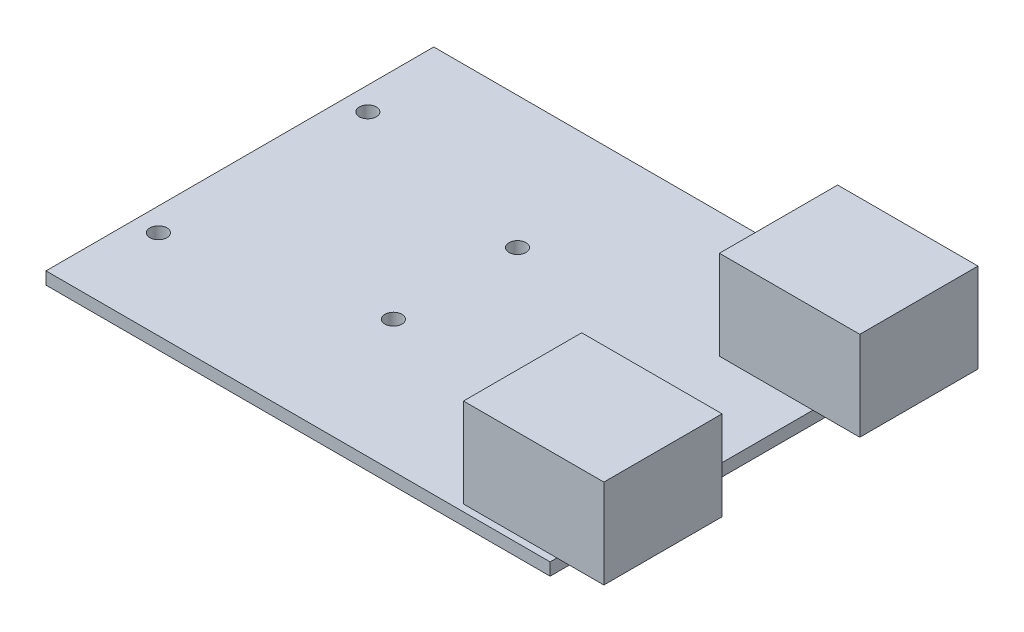
ISO-10303-21;
HEADER;
FILE_DESCRIPTION(('STEP AP214'),'2;1');
FILE_NAME('part.step','',(''),(''),'','','');
FILE_SCHEMA(('AUTOMOTIVE_DESIGN { 1 0 10303 214 1 1 1 1 }'));
ENDSEC;
DATA;
#1=APPLICATION_CONTEXT('core data for automotive mechanical design processes');
#2=APPLICATION_PROTOCOL_DEFINITION('international standard','automotive_design',2000,#1);
#3=PRODUCT_CONTEXT('',#1,'mechanical');
#4=PRODUCT('Part','Part','',(#3));
#5=PRODUCT_RELATED_PRODUCT_CATEGORY('part','',(#4));
#6=PRODUCT_DEFINITION_FORMATION('','',#4);
#7=PRODUCT_DEFINITION_CONTEXT('part definition',#1,'design');
#8=PRODUCT_DEFINITION('design','',#6,#7);
#9=PRODUCT_DEFINITION_SHAPE('','',#8);
#10=(LENGTH_UNIT() NAMED_UNIT(*) SI_UNIT(.MILLI.,.METRE.));
#11=(NAMED_UNIT(*) PLANE_ANGLE_UNIT() SI_UNIT($,.RADIAN.));
#12=(NAMED_UNIT(*) SI_UNIT($,.STERADIAN.) SOLID_ANGLE_UNIT());
#13=UNCERTAINTY_MEASURE_WITH_UNIT(LENGTH_MEASURE(1.E-05),#10,'distance_accuracy_value','');
#14=(GEOMETRIC_REPRESENTATION_CONTEXT(3) GLOBAL_UNCERTAINTY_ASSIGNED_CONTEXT((#13)) GLOBAL_UNIT_ASSIGNED_CONTEXT((#10,
#11,#12)) REPRESENTATION_CONTEXT('',''));
#15=CARTESIAN_POINT('',(0.,0.,0.));
#16=DIRECTION('',(0.,0.,1.));
#17=DIRECTION('',(1.,0.,0.));
#18=AXIS2_PLACEMENT_3D('',#15,#16,#17);
#19=CARTESIAN_POINT('',(0.,1.6002,0.));
#20=DIRECTION('',(0.,-1.,0.));
#21=DIRECTION('',(0.,0.,-1.));
#22=AXIS2_PLACEMENT_3D('',#19,#20,#21);
#23=PLANE('',#22);
#24=CARTESIAN_POINT('',(3.,1.6002,-11.5));
#25=DIRECTION('',(0.,1.,0.));
#26=DIRECTION('',(0.,0.,1.));
#27=AXIS2_PLACEMENT_3D('',#24,#25,#26);
#28=CIRCLE('',#27,1.09999999999999);
#29=CARTESIAN_POINT('',(3.,1.6002,-10.4));
#30=VERTEX_POINT('',#29);
#31=EDGE_CURVE('E197',#30,#30,#28,.T.);
#32=ORIENTED_EDGE('',*,*,#31,.F.);
#33=EDGE_LOOP('',(#32));
#34=FACE_BOUND('',#33,.T.);
#35=CARTESIAN_POINT('',(3.,1.6002,-38.5));
#36=DIRECTION('',(0.,1.,0.));
#37=DIRECTION('',(0.,0.,1.));
#38=AXIS2_PLACEMENT_3D('',#35,#36,#37);
#39=CIRCLE('',#38,1.09999999999999);
#40=CARTESIAN_POINT('',(3.,1.6002,-37.4));
#41=VERTEX_POINT('',#40);
#42=EDGE_CURVE('E203',#41,#41,#39,.T.);
#43=ORIENTED_EDGE('',*,*,#42,.F.);
#44=EDGE_LOOP('',(#43));
#45=FACE_BOUND('',#44,.T.);
#46=CARTESIAN_POINT('',(27.8,1.6002,-17.));
#47=DIRECTION('',(0.,1.,0.));
#48=DIRECTION('',(0.,0.,1.));
#49=AXIS2_PLACEMENT_3D('',#46,#47,#48);
#50=CIRCLE('',#49,1.09999999999999);
#51=CARTESIAN_POINT('',(27.8,1.6002,-15.9));
#52=VERTEX_POINT('',#51);
#53=EDGE_CURVE('E209',#52,#52,#50,.T.);
#54=ORIENTED_EDGE('',*,*,#53,.F.);
#55=EDGE_LOOP('',(#54));
#56=FACE_BOUND('',#55,.T.);
#57=CARTESIAN_POINT('',(27.8,1.6002,-33.));
#58=DIRECTION('',(0.,1.,0.));
#59=DIRECTION('',(0.,0.,1.));
#60=AXIS2_PLACEMENT_3D('',#57,#58,#59);
#61=CIRCLE('',#60,1.09999999999999);
#62=CARTESIAN_POINT('',(27.8,1.6002,-31.9));
#63=VERTEX_POINT('',#62);
#64=EDGE_CURVE('E215',#63,#63,#61,.T.);
#65=ORIENTED_EDGE('',*,*,#64,.F.);
#66=EDGE_LOOP('',(#65));
#67=FACE_BOUND('',#66,.T.);
#68=DIRECTION('',(-1.,0.,0.));
#69=VECTOR('',#68,1.);
#70=CARTESIAN_POINT('',(52.95,1.6002,-16.12));
#71=LINE('',#70,#69);
#72=CARTESIAN_POINT('',(65.,1.6002,-16.12));
#73=VERTEX_POINT('',#72);
#74=CARTESIAN_POINT('',(52.95,1.6002,-16.12));
#75=VERTEX_POINT('',#74);
#76=EDGE_CURVE('E276',#73,#75,#71,.T.);
#77=ORIENTED_EDGE('',*,*,#76,.F.);
#78=DIRECTION('',(0.,0.,-1.));
#79=VECTOR('',#78,1.);
#80=CARTESIAN_POINT('',(65.,1.6002,0.));
#81=LINE('',#80,#79);
#82=CARTESIAN_POINT('',(65.,1.6002,-33.88));
#83=VERTEX_POINT('',#82);
#84=EDGE_CURVE('E233',#73,#83,#81,.T.);
#85=ORIENTED_EDGE('',*,*,#84,.T.);
#86=DIRECTION('',(1.,0.,0.));
#87=VECTOR('',#86,1.);
#88=CARTESIAN_POINT('',(52.95,1.6002,-33.88));
#89=LINE('',#88,#87);
#90=CARTESIAN_POINT('',(52.95,1.6002,-33.88));
#91=VERTEX_POINT('',#90);
#92=EDGE_CURVE('E172',#91,#83,#89,.T.);
#93=ORIENTED_EDGE('',*,*,#92,.F.);
#94=DIRECTION('',(0.,0.,1.));
#95=VECTOR('',#94,1.);
#96=CARTESIAN_POINT('',(52.95,1.6002,-33.88));
#97=LINE('',#96,#95);
#98=CARTESIAN_POINT('',(52.95,1.6002,-49.12));
#99=VERTEX_POINT('',#98);
#100=EDGE_CURVE('E180',#99,#91,#97,.T.);
#101=ORIENTED_EDGE('',*,*,#100,.F.);
#102=DIRECTION('',(-1.,0.,0.));
#103=VECTOR('',#102,1.);
#104=CARTESIAN_POINT('',(52.95,1.6002,-49.12));
#105=LINE('',#104,#103);
#106=CARTESIAN_POINT('',(65.,1.6002,-49.12));
#107=VERTEX_POINT('',#106);
#108=EDGE_CURVE('E11',#107,#99,#105,.T.);
#109=ORIENTED_EDGE('',*,*,#108,.F.);
#110=CARTESIAN_POINT('',(65.,1.6002,-50.));
#111=VERTEX_POINT('',#110);
#112=EDGE_CURVE('E228',#107,#111,#81,.T.);
#113=ORIENTED_EDGE('',*,*,#112,.T.);
#114=DIRECTION('',(-1.,0.,0.));
#115=VECTOR('',#114,1.);
#116=CARTESIAN_POINT('',(0.,1.6002,-50.));
#117=LINE('',#116,#115);
#118=CARTESIAN_POINT('',(0.,1.6002,-50.));
#119=VERTEX_POINT('',#118);
#120=EDGE_CURVE('E231',#111,#119,#117,.T.);
#121=ORIENTED_EDGE('',*,*,#120,.T.);
#122=DIRECTION('',(0.,0.,1.));
#123=VECTOR('',#122,1.);
#124=CARTESIAN_POINT('',(0.,1.6002,0.));
#125=LINE('',#124,#123);
#126=CARTESIAN_POINT('',(0.,1.6002,0.));
#127=VERTEX_POINT('',#126);
#128=EDGE_CURVE('E222',#119,#127,#125,.T.);
#129=ORIENTED_EDGE('',*,*,#128,.T.);
#130=DIRECTION('',(1.,0.,0.));
#131=VECTOR('',#130,1.);
#132=CARTESIAN_POINT('',(0.,1.6002,0.));
#133=LINE('',#132,#131);
#134=CARTESIAN_POINT('',(65.,1.6002,0.));
#135=VERTEX_POINT('',#134);
#136=EDGE_CURVE('E225',#127,#135,#133,.T.);
#137=ORIENTED_EDGE('',*,*,#136,.T.);
#138=CARTESIAN_POINT('',(65.,1.6002,-0.879999999999995));
#139=VERTEX_POINT('',#138);
#140=EDGE_CURVE('E229',#135,#139,#81,.T.);
#141=ORIENTED_EDGE('',*,*,#140,.T.);
#142=DIRECTION('',(1.,0.,0.));
#143=VECTOR('',#142,1.);
#144=CARTESIAN_POINT('',(52.95,1.6002,-0.879999999999995));
#145=LINE('',#144,#143);
#146=CARTESIAN_POINT('',(52.95,1.6002,-0.879999999999995));
#147=VERTEX_POINT('',#146);
#148=EDGE_CURVE('E54',#147,#139,#145,.T.);
#149=ORIENTED_EDGE('',*,*,#148,.F.);
#150=DIRECTION('',(0.,0.,1.));
#151=VECTOR('',#150,1.);
#152=CARTESIAN_POINT('',(52.95,1.6002,-0.879999999999995));
#153=LINE('',#152,#151);
#154=EDGE_CURVE('E49',#75,#147,#153,.T.);
#155=ORIENTED_EDGE('',*,*,#154,.F.);
#156=EDGE_LOOP('',(#77,#85,#93,#101,#109,#113,#121,#129,#137,#141,#149,#155));
#157=FACE_BOUND('',#156,.T.);
#158=ADVANCED_FACE('F32',(#34,#45,#56,#67,#157),#23,.F.);
#159=CARTESIAN_POINT('',(0.,1.6002,0.));
#160=DIRECTION('',(1.,0.,0.));
#161=DIRECTION('',(0.,0.,-1.));
#162=AXIS2_PLACEMENT_3D('',#159,#160,#161);
#163=PLANE('',#162);
#164=DIRECTION('',(0.,0.,1.));
#165=VECTOR('',#164,1.);
#166=CARTESIAN_POINT('',(0.,0.,0.));
#167=LINE('',#166,#165);
#168=CARTESIAN_POINT('',(0.,0.,-50.));
#169=VERTEX_POINT('',#168);
#170=CARTESIAN_POINT('',(0.,0.,0.));
#171=VERTEX_POINT('',#170);
#172=EDGE_CURVE('E221',#169,#171,#167,.T.);
#173=ORIENTED_EDGE('',*,*,#172,.T.);
#174=DIRECTION('',(0.,-1.,0.));
#175=VECTOR('',#174,1.);
#176=CARTESIAN_POINT('',(0.,1.6002,0.));
#177=LINE('',#176,#175);
#178=EDGE_CURVE('E36',#127,#171,#177,.T.);
#179=ORIENTED_EDGE('',*,*,#178,.F.);
#180=ORIENTED_EDGE('',*,*,#128,.F.);
#181=DIRECTION('',(0.,-1.,0.));
#182=VECTOR('',#181,1.);
#183=CARTESIAN_POINT('',(0.,1.6002,-50.));
#184=LINE('',#183,#182);
#185=EDGE_CURVE('E236',#119,#169,#184,.T.);
#186=ORIENTED_EDGE('',*,*,#185,.T.);
#187=EDGE_LOOP('',(#173,#179,#180,#186));
#188=FACE_BOUND('',#187,.T.);
#189=ADVANCED_FACE('F34',(#188),#163,.F.);
#190=CARTESIAN_POINT('',(0.,1.6002,0.));
#191=DIRECTION('',(0.,0.,-1.));
#192=DIRECTION('',(-1.,0.,0.));
#193=AXIS2_PLACEMENT_3D('',#190,#191,#192);
#194=PLANE('',#193);
#195=DIRECTION('',(1.,0.,0.));
#196=VECTOR('',#195,1.);
#197=CARTESIAN_POINT('',(0.,0.,0.));
#198=LINE('',#197,#196);
#199=CARTESIAN_POINT('',(65.,0.,0.));
#200=VERTEX_POINT('',#199);
#201=EDGE_CURVE('E239',#171,#200,#198,.T.);
#202=ORIENTED_EDGE('',*,*,#201,.T.);
#203=DIRECTION('',(0.,-1.,0.));
#204=VECTOR('',#203,1.);
#205=CARTESIAN_POINT('',(65.,1.6002,0.));
#206=LINE('',#205,#204);
#207=EDGE_CURVE('E248',#135,#200,#206,.T.);
#208=ORIENTED_EDGE('',*,*,#207,.F.);
#209=ORIENTED_EDGE('',*,*,#136,.F.);
#210=ORIENTED_EDGE('',*,*,#178,.T.);
#211=EDGE_LOOP('',(#202,#208,#209,#210));
#212=FACE_BOUND('',#211,.T.);
#213=ADVANCED_FACE('F257',(#212),#194,.F.);
#214=CARTESIAN_POINT('',(65.,1.6002,0.));
#215=DIRECTION('',(-1.,0.,0.));
#216=DIRECTION('',(0.,0.,1.));
#217=AXIS2_PLACEMENT_3D('',#214,#215,#216);
#218=PLANE('',#217);
#219=DIRECTION('',(0.,0.,-1.));
#220=VECTOR('',#219,1.);
#221=CARTESIAN_POINT('',(65.,0.,0.));
#222=LINE('',#221,#220);
#223=CARTESIAN_POINT('',(65.,0.,-50.));
#224=VERTEX_POINT('',#223);
#225=EDGE_CURVE('E241',#200,#224,#222,.T.);
#226=ORIENTED_EDGE('',*,*,#225,.T.);
#227=DIRECTION('',(0.,-1.,0.));
#228=VECTOR('',#227,1.);
#229=CARTESIAN_POINT('',(65.,1.6002,-50.));
#230=LINE('',#229,#228);
#231=EDGE_CURVE('E246',#111,#224,#230,.T.);
#232=ORIENTED_EDGE('',*,*,#231,.F.);
#233=ORIENTED_EDGE('',*,*,#112,.F.);
#234=EDGE_CURVE('E234',#83,#107,#81,.T.);
#235=ORIENTED_EDGE('',*,*,#234,.F.);
#236=ORIENTED_EDGE('',*,*,#84,.F.);
#237=EDGE_CURVE('E232',#139,#73,#81,.T.);
#238=ORIENTED_EDGE('',*,*,#237,.F.);
#239=ORIENTED_EDGE('',*,*,#140,.F.);
#240=ORIENTED_EDGE('',*,*,#207,.T.);
#241=EDGE_LOOP('',(#226,#232,#233,#235,#236,#238,#239,#240));
#242=FACE_BOUND('',#241,.T.);
#243=ADVANCED_FACE('F266',(#242),#218,.F.);
#244=CARTESIAN_POINT('',(0.,1.6002,-50.));
#245=DIRECTION('',(0.,0.,1.));
#246=DIRECTION('',(1.,0.,0.));
#247=AXIS2_PLACEMENT_3D('',#244,#245,#246);
#248=PLANE('',#247);
#249=DIRECTION('',(-1.,0.,0.));
#250=VECTOR('',#249,1.);
#251=CARTESIAN_POINT('',(0.,0.,-50.));
#252=LINE('',#251,#250);
#253=EDGE_CURVE('E226',#224,#169,#252,.T.);
#254=ORIENTED_EDGE('',*,*,#253,.T.);
#255=ORIENTED_EDGE('',*,*,#185,.F.);
#256=ORIENTED_EDGE('',*,*,#120,.F.);
#257=ORIENTED_EDGE('',*,*,#231,.T.);
#258=EDGE_LOOP('',(#254,#255,#256,#257));
#259=FACE_BOUND('',#258,.T.);
#260=ADVANCED_FACE('F270',(#259),#248,.F.);
#261=CARTESIAN_POINT('',(0.,0.,0.));
#262=DIRECTION('',(0.,-1.,0.));
#263=DIRECTION('',(0.,0.,-1.));
#264=AXIS2_PLACEMENT_3D('',#261,#262,#263);
#265=PLANE('',#264);
#266=CARTESIAN_POINT('',(3.,0.,-11.5));
#267=DIRECTION('',(0.,1.,0.));
#268=DIRECTION('',(0.,0.,1.));
#269=AXIS2_PLACEMENT_3D('',#266,#267,#268);
#270=CIRCLE('',#269,1.1);
#271=CARTESIAN_POINT('',(3.,0.,-10.4));
#272=VERTEX_POINT('',#271);
#273=EDGE_CURVE('E200',#272,#272,#270,.T.);
#274=ORIENTED_EDGE('',*,*,#273,.T.);
#275=EDGE_LOOP('',(#274));
#276=FACE_BOUND('',#275,.T.);
#277=CARTESIAN_POINT('',(3.,0.,-38.5));
#278=DIRECTION('',(0.,1.,0.));
#279=DIRECTION('',(0.,0.,1.));
#280=AXIS2_PLACEMENT_3D('',#277,#278,#279);
#281=CIRCLE('',#280,1.1);
#282=CARTESIAN_POINT('',(3.,0.,-37.4));
#283=VERTEX_POINT('',#282);
#284=EDGE_CURVE('E206',#283,#283,#281,.T.);
#285=ORIENTED_EDGE('',*,*,#284,.T.);
#286=EDGE_LOOP('',(#285));
#287=FACE_BOUND('',#286,.T.);
#288=CARTESIAN_POINT('',(27.8,0.,-17.));
#289=DIRECTION('',(0.,1.,0.));
#290=DIRECTION('',(0.,0.,1.));
#291=AXIS2_PLACEMENT_3D('',#288,#289,#290);
#292=CIRCLE('',#291,1.1);
#293=CARTESIAN_POINT('',(27.8,0.,-15.9));
#294=VERTEX_POINT('',#293);
#295=EDGE_CURVE('E212',#294,#294,#292,.T.);
#296=ORIENTED_EDGE('',*,*,#295,.T.);
#297=EDGE_LOOP('',(#296));
#298=FACE_BOUND('',#297,.T.);
#299=CARTESIAN_POINT('',(27.8,0.,-33.));
#300=DIRECTION('',(0.,1.,0.));
#301=DIRECTION('',(0.,0.,1.));
#302=AXIS2_PLACEMENT_3D('',#299,#300,#301);
#303=CIRCLE('',#302,1.1);
#304=CARTESIAN_POINT('',(27.8,0.,-31.9));
#305=VERTEX_POINT('',#304);
#306=EDGE_CURVE('E218',#305,#305,#303,.T.);
#307=ORIENTED_EDGE('',*,*,#306,.T.);
#308=EDGE_LOOP('',(#307));
#309=FACE_BOUND('',#308,.T.);
#310=ORIENTED_EDGE('',*,*,#172,.F.);
#311=ORIENTED_EDGE('',*,*,#253,.F.);
#312=ORIENTED_EDGE('',*,*,#225,.F.);
#313=ORIENTED_EDGE('',*,*,#201,.F.);
#314=EDGE_LOOP('',(#310,#311,#312,#313));
#315=FACE_BOUND('',#314,.T.);
#316=ADVANCED_FACE('F264',(#276,#287,#298,#309,#315),#265,.T.);
#317=CARTESIAN_POINT('',(27.8,1.6002,-33.));
#318=DIRECTION('',(0.,1.,0.));
#319=DIRECTION('',(0.,0.,1.));
#320=AXIS2_PLACEMENT_3D('',#317,#318,#319);
#321=CYLINDRICAL_SURFACE('',#320,1.09999999999999);
#322=ORIENTED_EDGE('',*,*,#306,.F.);
#323=EDGE_LOOP('',(#322));
#324=FACE_BOUND('',#323,.T.);
#325=ORIENTED_EDGE('',*,*,#64,.T.);
#326=EDGE_LOOP('',(#325));
#327=FACE_BOUND('',#326,.T.);
#328=ADVANCED_FACE('F318',(#324,#327),#321,.F.);
#329=CARTESIAN_POINT('',(27.8,1.6002,-17.));
#330=DIRECTION('',(0.,1.,0.));
#331=DIRECTION('',(0.,0.,1.));
#332=AXIS2_PLACEMENT_3D('',#329,#330,#331);
#333=CYLINDRICAL_SURFACE('',#332,1.09999999999999);
#334=ORIENTED_EDGE('',*,*,#295,.F.);
#335=EDGE_LOOP('',(#334));
#336=FACE_BOUND('',#335,.T.);
#337=ORIENTED_EDGE('',*,*,#53,.T.);
#338=EDGE_LOOP('',(#337));
#339=FACE_BOUND('',#338,.T.);
#340=ADVANCED_FACE('F350',(#336,#339),#333,.F.);
#341=CARTESIAN_POINT('',(3.,1.6002,-38.5));
#342=DIRECTION('',(0.,1.,0.));
#343=DIRECTION('',(0.,0.,1.));
#344=AXIS2_PLACEMENT_3D('',#341,#342,#343);
#345=CYLINDRICAL_SURFACE('',#344,1.09999999999999);
#346=ORIENTED_EDGE('',*,*,#284,.F.);
#347=EDGE_LOOP('',(#346));
#348=FACE_BOUND('',#347,.T.);
#349=ORIENTED_EDGE('',*,*,#42,.T.);
#350=EDGE_LOOP('',(#349));
#351=FACE_BOUND('',#350,.T.);
#352=ADVANCED_FACE('F357',(#348,#351),#345,.F.);
#353=CARTESIAN_POINT('',(3.,1.6002,-11.5));
#354=DIRECTION('',(0.,1.,0.));
#355=DIRECTION('',(0.,0.,1.));
#356=AXIS2_PLACEMENT_3D('',#353,#354,#355);
#357=CYLINDRICAL_SURFACE('',#356,1.09999999999999);
#358=ORIENTED_EDGE('',*,*,#273,.F.);
#359=EDGE_LOOP('',(#358));
#360=FACE_BOUND('',#359,.T.);
#361=ORIENTED_EDGE('',*,*,#31,.T.);
#362=EDGE_LOOP('',(#361));
#363=FACE_BOUND('',#362,.T.);
#364=ADVANCED_FACE('F364',(#360,#363),#357,.F.);
#365=CARTESIAN_POINT('',(71.05,13.1002,-33.88));
#366=DIRECTION('',(-1.,0.,0.));
#367=DIRECTION('',(0.,0.,1.));
#368=AXIS2_PLACEMENT_3D('',#365,#366,#367);
#369=PLANE('',#368);
#370=DIRECTION('',(0.,0.,-1.));
#371=VECTOR('',#370,1.);
#372=CARTESIAN_POINT('',(71.05,1.6002,-33.88));
#373=LINE('',#372,#371);
#374=CARTESIAN_POINT('',(71.05,1.6002,-33.88));
#375=VERTEX_POINT('',#374);
#376=CARTESIAN_POINT('',(71.05,1.6002,-49.12));
#377=VERTEX_POINT('',#376);
#378=EDGE_CURVE('E160',#375,#377,#373,.T.);
#379=ORIENTED_EDGE('',*,*,#378,.T.);
#380=DIRECTION('',(0.,-1.,0.));
#381=VECTOR('',#380,1.);
#382=CARTESIAN_POINT('',(71.05,13.1002,-49.12));
#383=LINE('',#382,#381);
#384=CARTESIAN_POINT('',(71.05,13.1002,-49.12));
#385=VERTEX_POINT('',#384);
#386=EDGE_CURVE('E194',#385,#377,#383,.T.);
#387=ORIENTED_EDGE('',*,*,#386,.F.);
#388=DIRECTION('',(0.,0.,-1.));
#389=VECTOR('',#388,1.);
#390=CARTESIAN_POINT('',(71.05,13.1002,-33.88));
#391=LINE('',#390,#389);
#392=CARTESIAN_POINT('',(71.05,13.1002,-33.88));
#393=VERTEX_POINT('',#392);
#394=EDGE_CURVE('E168',#393,#385,#391,.T.);
#395=ORIENTED_EDGE('',*,*,#394,.F.);
#396=DIRECTION('',(0.,-1.,0.));
#397=VECTOR('',#396,1.);
#398=CARTESIAN_POINT('',(71.05,13.1002,-33.88));
#399=LINE('',#398,#397);
#400=EDGE_CURVE('E177',#393,#375,#399,.T.);
#401=ORIENTED_EDGE('',*,*,#400,.T.);
#402=EDGE_LOOP('',(#379,#387,#395,#401));
#403=FACE_BOUND('',#402,.T.);
#404=ADVANCED_FACE('F295',(#403),#369,.F.);
#405=CARTESIAN_POINT('',(52.95,13.1002,-49.12));
#406=DIRECTION('',(0.,0.,1.));
#407=DIRECTION('',(1.,0.,0.));
#408=AXIS2_PLACEMENT_3D('',#405,#406,#407);
#409=PLANE('',#408);
#410=EDGE_CURVE('E42',#377,#107,#105,.T.);
#411=ORIENTED_EDGE('',*,*,#410,.T.);
#412=ORIENTED_EDGE('',*,*,#108,.T.);
#413=DIRECTION('',(0.,-1.,0.));
#414=VECTOR('',#413,1.);
#415=CARTESIAN_POINT('',(52.95,13.1002,-49.12));
#416=LINE('',#415,#414);
#417=CARTESIAN_POINT('',(52.95,13.1002,-49.12));
#418=VERTEX_POINT('',#417);
#419=EDGE_CURVE('E191',#418,#99,#416,.T.);
#420=ORIENTED_EDGE('',*,*,#419,.F.);
#421=DIRECTION('',(-1.,0.,0.));
#422=VECTOR('',#421,1.);
#423=CARTESIAN_POINT('',(52.95,13.1002,-49.12));
#424=LINE('',#423,#422);
#425=EDGE_CURVE('E171',#385,#418,#424,.T.);
#426=ORIENTED_EDGE('',*,*,#425,.F.);
#427=ORIENTED_EDGE('',*,*,#386,.T.);
#428=EDGE_LOOP('',(#411,#412,#420,#426,#427));
#429=FACE_BOUND('',#428,.T.);
#430=ADVANCED_FACE('F291',(#429),#409,.F.);
#431=CARTESIAN_POINT('',(52.95,13.1002,-33.88));
#432=DIRECTION('',(1.,0.,0.));
#433=DIRECTION('',(0.,0.,-1.));
#434=AXIS2_PLACEMENT_3D('',#431,#432,#433);
#435=PLANE('',#434);
#436=ORIENTED_EDGE('',*,*,#100,.T.);
#437=DIRECTION('',(0.,-1.,0.));
#438=VECTOR('',#437,1.);
#439=CARTESIAN_POINT('',(52.95,13.1002,-33.88));
#440=LINE('',#439,#438);
#441=CARTESIAN_POINT('',(52.95,13.1002,-33.88));
#442=VERTEX_POINT('',#441);
#443=EDGE_CURVE('E188',#442,#91,#440,.T.);
#444=ORIENTED_EDGE('',*,*,#443,.F.);
#445=DIRECTION('',(0.,0.,1.));
#446=VECTOR('',#445,1.);
#447=CARTESIAN_POINT('',(52.95,13.1002,-33.88));
#448=LINE('',#447,#446);
#449=EDGE_CURVE('E174',#418,#442,#448,.T.);
#450=ORIENTED_EDGE('',*,*,#449,.F.);
#451=ORIENTED_EDGE('',*,*,#419,.T.);
#452=EDGE_LOOP('',(#436,#444,#450,#451));
#453=FACE_BOUND('',#452,.T.);
#454=ADVANCED_FACE('F288',(#453),#435,.F.);
#455=CARTESIAN_POINT('',(52.95,13.1002,-33.88));
#456=DIRECTION('',(0.,0.,-1.));
#457=DIRECTION('',(-1.,0.,0.));
#458=AXIS2_PLACEMENT_3D('',#455,#456,#457);
#459=PLANE('',#458);
#460=ORIENTED_EDGE('',*,*,#92,.T.);
#461=EDGE_CURVE('E183',#83,#375,#89,.T.);
#462=ORIENTED_EDGE('',*,*,#461,.T.);
#463=ORIENTED_EDGE('',*,*,#400,.F.);
#464=DIRECTION('',(1.,0.,0.));
#465=VECTOR('',#464,1.);
#466=CARTESIAN_POINT('',(52.95,13.1002,-33.88));
#467=LINE('',#466,#465);
#468=EDGE_CURVE('E176',#442,#393,#467,.T.);
#469=ORIENTED_EDGE('',*,*,#468,.F.);
#470=ORIENTED_EDGE('',*,*,#443,.T.);
#471=EDGE_LOOP('',(#460,#462,#463,#469,#470));
#472=FACE_BOUND('',#471,.T.);
#473=ADVANCED_FACE('F283',(#472),#459,.F.);
#474=CARTESIAN_POINT('',(0.,13.1002,0.));
#475=DIRECTION('',(0.,-1.,0.));
#476=DIRECTION('',(0.,0.,-1.));
#477=AXIS2_PLACEMENT_3D('',#474,#475,#476);
#478=PLANE('',#477);
#479=ORIENTED_EDGE('',*,*,#394,.T.);
#480=ORIENTED_EDGE('',*,*,#425,.T.);
#481=ORIENTED_EDGE('',*,*,#449,.T.);
#482=ORIENTED_EDGE('',*,*,#468,.T.);
#483=EDGE_LOOP('',(#479,#480,#481,#482));
#484=FACE_BOUND('',#483,.T.);
#485=ADVANCED_FACE('F297',(#484),#478,.F.);
#486=CARTESIAN_POINT('',(0.,1.6002,0.));
#487=DIRECTION('',(0.,-1.,0.));
#488=DIRECTION('',(0.,0.,-1.));
#489=AXIS2_PLACEMENT_3D('',#486,#487,#488);
#490=PLANE('',#489);
#491=ORIENTED_EDGE('',*,*,#461,.F.);
#492=ORIENTED_EDGE('',*,*,#234,.T.);
#493=ORIENTED_EDGE('',*,*,#410,.F.);
#494=ORIENTED_EDGE('',*,*,#378,.F.);
#495=EDGE_LOOP('',(#491,#492,#493,#494));
#496=FACE_BOUND('',#495,.T.);
#497=ADVANCED_FACE('F280',(#496),#490,.T.);
#498=CARTESIAN_POINT('',(0.,1.6002,0.));
#499=DIRECTION('',(0.,-1.,0.));
#500=DIRECTION('',(0.,0.,-1.));
#501=AXIS2_PLACEMENT_3D('',#498,#499,#500);
#502=PLANE('',#501);
#503=ORIENTED_EDGE('',*,*,#237,.T.);
#504=CARTESIAN_POINT('',(71.05,1.6002,-16.12));
#505=VERTEX_POINT('',#504);
#506=EDGE_CURVE('E470',#505,#73,#71,.T.);
#507=ORIENTED_EDGE('',*,*,#506,.F.);
#508=DIRECTION('',(0.,0.,-1.));
#509=VECTOR('',#508,1.);
#510=CARTESIAN_POINT('',(71.05,1.6002,-0.880000000000001));
#511=LINE('',#510,#509);
#512=CARTESIAN_POINT('',(71.05,1.6002,-0.880000000000001));
#513=VERTEX_POINT('',#512);
#514=EDGE_CURVE('E159',#513,#505,#511,.T.);
#515=ORIENTED_EDGE('',*,*,#514,.F.);
#516=EDGE_CURVE('E460',#139,#513,#145,.T.);
#517=ORIENTED_EDGE('',*,*,#516,.F.);
#518=EDGE_LOOP('',(#503,#507,#515,#517));
#519=FACE_BOUND('',#518,.T.);
#520=ADVANCED_FACE('F304',(#519),#502,.T.);
#521=CARTESIAN_POINT('',(71.05,13.1002,-0.880000000000001));
#522=DIRECTION('',(-1.,0.,0.));
#523=DIRECTION('',(0.,0.,1.));
#524=AXIS2_PLACEMENT_3D('',#521,#522,#523);
#525=PLANE('',#524);
#526=ORIENTED_EDGE('',*,*,#514,.T.);
#527=DIRECTION('',(0.,-1.,0.));
#528=VECTOR('',#527,1.);
#529=CARTESIAN_POINT('',(71.05,13.1002,-16.12));
#530=LINE('',#529,#528);
#531=CARTESIAN_POINT('',(71.05,13.1002,-16.12));
#532=VERTEX_POINT('',#531);
#533=EDGE_CURVE('E140',#532,#505,#530,.T.);
#534=ORIENTED_EDGE('',*,*,#533,.F.);
#535=DIRECTION('',(0.,0.,-1.));
#536=VECTOR('',#535,1.);
#537=CARTESIAN_POINT('',(71.05,13.1002,-0.880000000000001));
#538=LINE('',#537,#536);
#539=CARTESIAN_POINT('',(71.05,13.1002,-0.880000000000001));
#540=VERTEX_POINT('',#539);
#541=EDGE_CURVE('E147',#540,#532,#538,.T.);
#542=ORIENTED_EDGE('',*,*,#541,.F.);
#543=DIRECTION('',(0.,-1.,0.));
#544=VECTOR('',#543,1.);
#545=CARTESIAN_POINT('',(71.05,13.1002,-0.880000000000001));
#546=LINE('',#545,#544);
#547=EDGE_CURVE('E466',#540,#513,#546,.T.);
#548=ORIENTED_EDGE('',*,*,#547,.T.);
#549=EDGE_LOOP('',(#526,#534,#542,#548));
#550=FACE_BOUND('',#549,.T.);
#551=ADVANCED_FACE('F157',(#550),#525,.F.);
#552=CARTESIAN_POINT('',(52.95,13.1002,-16.12));
#553=DIRECTION('',(0.,0.,1.));
#554=DIRECTION('',(1.,0.,0.));
#555=AXIS2_PLACEMENT_3D('',#552,#553,#554);
#556=PLANE('',#555);
#557=ORIENTED_EDGE('',*,*,#506,.T.);
#558=ORIENTED_EDGE('',*,*,#76,.T.);
#559=DIRECTION('',(0.,-1.,0.));
#560=VECTOR('',#559,1.);
#561=CARTESIAN_POINT('',(52.95,13.1002,-16.12));
#562=LINE('',#561,#560);
#563=CARTESIAN_POINT('',(52.95,13.1002,-16.12));
#564=VERTEX_POINT('',#563);
#565=EDGE_CURVE('E143',#564,#75,#562,.T.);
#566=ORIENTED_EDGE('',*,*,#565,.F.);
#567=DIRECTION('',(-1.,0.,0.));
#568=VECTOR('',#567,1.);
#569=CARTESIAN_POINT('',(52.95,13.1002,-16.12));
#570=LINE('',#569,#568);
#571=EDGE_CURVE('E135',#532,#564,#570,.T.);
#572=ORIENTED_EDGE('',*,*,#571,.F.);
#573=ORIENTED_EDGE('',*,*,#533,.T.);
#574=EDGE_LOOP('',(#557,#558,#566,#572,#573));
#575=FACE_BOUND('',#574,.T.);
#576=ADVANCED_FACE('F138',(#575),#556,.F.);
#577=CARTESIAN_POINT('',(52.95,13.1002,-0.879999999999995));
#578=DIRECTION('',(1.,0.,0.));
#579=DIRECTION('',(0.,0.,-1.));
#580=AXIS2_PLACEMENT_3D('',#577,#578,#579);
#581=PLANE('',#580);
#582=ORIENTED_EDGE('',*,*,#154,.T.);
#583=DIRECTION('',(0.,-1.,0.));
#584=VECTOR('',#583,1.);
#585=CARTESIAN_POINT('',(52.95,13.1002,-0.879999999999995));
#586=LINE('',#585,#584);
#587=CARTESIAN_POINT('',(52.95,13.1002,-0.879999999999995));
#588=VERTEX_POINT('',#587);
#589=EDGE_CURVE('E164',#588,#147,#586,.T.);
#590=ORIENTED_EDGE('',*,*,#589,.F.);
#591=DIRECTION('',(0.,0.,1.));
#592=VECTOR('',#591,1.);
#593=CARTESIAN_POINT('',(52.95,13.1002,-0.879999999999995));
#594=LINE('',#593,#592);
#595=EDGE_CURVE('E146',#564,#588,#594,.T.);
#596=ORIENTED_EDGE('',*,*,#595,.F.);
#597=ORIENTED_EDGE('',*,*,#565,.T.);
#598=EDGE_LOOP('',(#582,#590,#596,#597));
#599=FACE_BOUND('',#598,.T.);
#600=ADVANCED_FACE('F428',(#599),#581,.F.);
#601=CARTESIAN_POINT('',(52.95,13.1002,-0.879999999999995));
#602=DIRECTION('',(0.,0.,-1.));
#603=DIRECTION('',(-1.,0.,0.));
#604=AXIS2_PLACEMENT_3D('',#601,#602,#603);
#605=PLANE('',#604);
#606=ORIENTED_EDGE('',*,*,#148,.T.);
#607=ORIENTED_EDGE('',*,*,#516,.T.);
#608=ORIENTED_EDGE('',*,*,#547,.F.);
#609=DIRECTION('',(1.,0.,0.));
#610=VECTOR('',#609,1.);
#611=CARTESIAN_POINT('',(52.95,13.1002,-0.879999999999995));
#612=LINE('',#611,#610);
#613=EDGE_CURVE('E152',#588,#540,#612,.T.);
#614=ORIENTED_EDGE('',*,*,#613,.F.);
#615=ORIENTED_EDGE('',*,*,#589,.T.);
#616=EDGE_LOOP('',(#606,#607,#608,#614,#615));
#617=FACE_BOUND('',#616,.T.);
#618=ADVANCED_FACE('F437',(#617),#605,.F.);
#619=CARTESIAN_POINT('',(0.,13.1002,0.));
#620=DIRECTION('',(0.,-1.,0.));
#621=DIRECTION('',(0.,0.,-1.));
#622=AXIS2_PLACEMENT_3D('',#619,#620,#621);
#623=PLANE('',#622);
#624=ORIENTED_EDGE('',*,*,#541,.T.);
#625=ORIENTED_EDGE('',*,*,#571,.T.);
#626=ORIENTED_EDGE('',*,*,#595,.T.);
#627=ORIENTED_EDGE('',*,*,#613,.T.);
#628=EDGE_LOOP('',(#624,#625,#626,#627));
#629=FACE_BOUND('',#628,.T.);
#630=ADVANCED_FACE('F150',(#629),#623,.F.);
#631=CLOSED_SHELL('',(#158,#189,#213,#243,#260,#316,#328,#340,#352,#364,#404,#430,#454,#473,
#485,#497,#520,#551,#576,#600,#618,#630));
#632=MANIFOLD_SOLID_BREP('B2',#631);
#633=ADVANCED_BREP_SHAPE_REPRESENTATION('',(#18,#632),#14);
#634=SHAPE_DEFINITION_REPRESENTATION(#9,#633);
ENDSEC;
END-ISO-10303-21;
